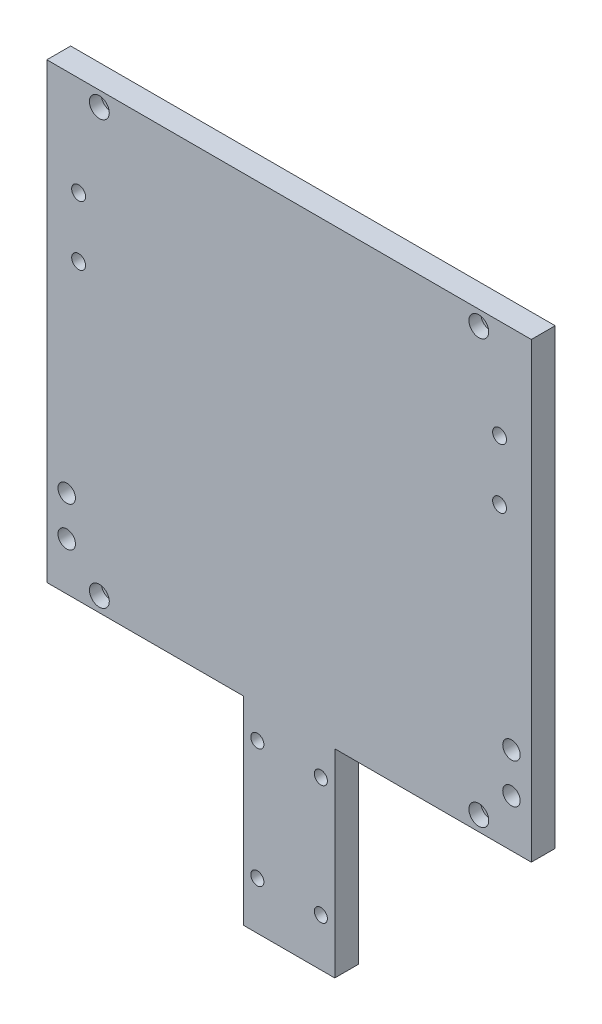
ISO-10303-21;
HEADER;
FILE_DESCRIPTION(('STEP AP214'),'2;1');
FILE_NAME('part.step','',(''),(''),'','','');
FILE_SCHEMA(('AUTOMOTIVE_DESIGN { 1 0 10303 214 1 1 1 1 }'));
ENDSEC;
DATA;
#1=APPLICATION_CONTEXT('core data for automotive mechanical design processes');
#2=APPLICATION_PROTOCOL_DEFINITION('international standard','automotive_design',2000,#1);
#3=PRODUCT_CONTEXT('',#1,'mechanical');
#4=PRODUCT('Part','Part','',(#3));
#5=PRODUCT_RELATED_PRODUCT_CATEGORY('part','',(#4));
#6=PRODUCT_DEFINITION_FORMATION('','',#4);
#7=PRODUCT_DEFINITION_CONTEXT('part definition',#1,'design');
#8=PRODUCT_DEFINITION('design','',#6,#7);
#9=PRODUCT_DEFINITION_SHAPE('','',#8);
#10=(LENGTH_UNIT() NAMED_UNIT(*) SI_UNIT(.MILLI.,.METRE.));
#11=(NAMED_UNIT(*) PLANE_ANGLE_UNIT() SI_UNIT($,.RADIAN.));
#12=(NAMED_UNIT(*) SI_UNIT($,.STERADIAN.) SOLID_ANGLE_UNIT());
#13=UNCERTAINTY_MEASURE_WITH_UNIT(LENGTH_MEASURE(1.E-05),#10,'distance_accuracy_value','');
#14=(GEOMETRIC_REPRESENTATION_CONTEXT(3) GLOBAL_UNCERTAINTY_ASSIGNED_CONTEXT((#13)) GLOBAL_UNIT_ASSIGNED_CONTEXT((#10,
#11,#12)) REPRESENTATION_CONTEXT('',''));
#15=CARTESIAN_POINT('',(0.,0.,0.));
#16=DIRECTION('',(0.,0.,1.));
#17=DIRECTION('',(1.,0.,0.));
#18=AXIS2_PLACEMENT_3D('',#15,#16,#17);
#19=CARTESIAN_POINT('',(-61.,-57.,6.));
#20=DIRECTION('',(0.,1.,0.));
#21=DIRECTION('',(0.,0.,1.));
#22=AXIS2_PLACEMENT_3D('',#19,#20,#21);
#23=PLANE('',#22);
#24=DIRECTION('',(0.,0.,1.));
#25=VECTOR('',#24,1.);
#26=CARTESIAN_POINT('',(11.5,-57.,0.));
#27=LINE('',#26,#25);
#28=CARTESIAN_POINT('',(11.5,-57.,0.));
#29=VERTEX_POINT('',#28);
#30=CARTESIAN_POINT('',(11.5,-57.,6.));
#31=VERTEX_POINT('',#30);
#32=EDGE_CURVE('E166',#29,#31,#27,.T.);
#33=ORIENTED_EDGE('',*,*,#32,.F.);
#34=DIRECTION('',(1.,0.,0.));
#35=VECTOR('',#34,1.);
#36=CARTESIAN_POINT('',(-61.,-57.,0.));
#37=LINE('',#36,#35);
#38=CARTESIAN_POINT('',(61.,-57.,0.));
#39=VERTEX_POINT('',#38);
#40=EDGE_CURVE('E92',#29,#39,#37,.T.);
#41=ORIENTED_EDGE('',*,*,#40,.T.);
#42=DIRECTION('',(0.,0.,-1.));
#43=VECTOR('',#42,1.);
#44=CARTESIAN_POINT('',(61.,-57.,6.));
#45=LINE('',#44,#43);
#46=CARTESIAN_POINT('',(61.,-57.,6.));
#47=VERTEX_POINT('',#46);
#48=EDGE_CURVE('E295',#47,#39,#45,.T.);
#49=ORIENTED_EDGE('',*,*,#48,.F.);
#50=DIRECTION('',(1.,0.,0.));
#51=VECTOR('',#50,1.);
#52=CARTESIAN_POINT('',(-61.,-57.,6.));
#53=LINE('',#52,#51);
#54=EDGE_CURVE('E70',#31,#47,#53,.T.);
#55=ORIENTED_EDGE('',*,*,#54,.F.);
#56=EDGE_LOOP('',(#33,#41,#49,#55));
#57=FACE_BOUND('',#56,.T.);
#58=ADVANCED_FACE('F43',(#57),#23,.F.);
#59=CARTESIAN_POINT('',(-47.78,53.28,0.));
#60=DIRECTION('',(0.,0.,1.));
#61=DIRECTION('',(1.,0.,0.));
#62=AXIS2_PLACEMENT_3D('',#59,#60,#61);
#63=CYLINDRICAL_SURFACE('',#62,1.65);
#64=CARTESIAN_POINT('',(-47.78,53.28,0.));
#65=DIRECTION('',(0.,0.,1.));
#66=DIRECTION('',(1.,0.,0.));
#67=AXIS2_PLACEMENT_3D('',#64,#65,#66);
#68=CIRCLE('',#67,1.65);
#69=CARTESIAN_POINT('',(-46.13,53.28,0.));
#70=VERTEX_POINT('',#69);
#71=EDGE_CURVE('E269',#70,#70,#68,.T.);
#72=ORIENTED_EDGE('',*,*,#71,.F.);
#73=EDGE_LOOP('',(#72));
#74=FACE_BOUND('',#73,.T.);
#75=CARTESIAN_POINT('',(-47.78,53.28,3.));
#76=DIRECTION('',(0.,0.,1.));
#77=DIRECTION('',(1.,0.,0.));
#78=AXIS2_PLACEMENT_3D('',#75,#76,#77);
#79=CIRCLE('',#78,1.65);
#80=CARTESIAN_POINT('',(-46.13,53.28,3.));
#81=VERTEX_POINT('',#80);
#82=EDGE_CURVE('E47',#81,#81,#79,.F.);
#83=ORIENTED_EDGE('',*,*,#82,.F.);
#84=EDGE_LOOP('',(#83));
#85=FACE_BOUND('',#84,.T.);
#86=ADVANCED_FACE('F335',(#74,#85),#63,.F.);
#87=CARTESIAN_POINT('',(47.78,-53.28,0.));
#88=DIRECTION('',(0.,0.,1.));
#89=DIRECTION('',(1.,0.,0.));
#90=AXIS2_PLACEMENT_3D('',#87,#88,#89);
#91=CYLINDRICAL_SURFACE('',#90,1.65);
#92=CARTESIAN_POINT('',(47.78,-53.28,0.));
#93=DIRECTION('',(0.,0.,1.));
#94=DIRECTION('',(1.,0.,0.));
#95=AXIS2_PLACEMENT_3D('',#92,#93,#94);
#96=CIRCLE('',#95,1.65);
#97=CARTESIAN_POINT('',(49.43,-53.28,0.));
#98=VERTEX_POINT('',#97);
#99=EDGE_CURVE('E270',#98,#98,#96,.T.);
#100=ORIENTED_EDGE('',*,*,#99,.F.);
#101=EDGE_LOOP('',(#100));
#102=FACE_BOUND('',#101,.T.);
#103=CARTESIAN_POINT('',(47.78,-53.28,3.));
#104=DIRECTION('',(0.,0.,1.));
#105=DIRECTION('',(1.,0.,0.));
#106=AXIS2_PLACEMENT_3D('',#103,#104,#105);
#107=CIRCLE('',#106,1.65);
#108=CARTESIAN_POINT('',(49.43,-53.28,3.));
#109=VERTEX_POINT('',#108);
#110=EDGE_CURVE('E319',#109,#109,#107,.F.);
#111=ORIENTED_EDGE('',*,*,#110,.F.);
#112=EDGE_LOOP('',(#111));
#113=FACE_BOUND('',#112,.T.);
#114=ADVANCED_FACE('F337',(#102,#113),#91,.F.);
#115=CARTESIAN_POINT('',(61.,57.,6.));
#116=DIRECTION('',(-1.,0.,0.));
#117=DIRECTION('',(0.,-1.,0.));
#118=AXIS2_PLACEMENT_3D('',#115,#116,#117);
#119=PLANE('',#118);
#120=DIRECTION('',(0.,1.,0.));
#121=VECTOR('',#120,1.);
#122=CARTESIAN_POINT('',(61.,57.,0.));
#123=LINE('',#122,#121);
#124=CARTESIAN_POINT('',(61.,57.,0.));
#125=VERTEX_POINT('',#124);
#126=EDGE_CURVE('E281',#39,#125,#123,.T.);
#127=ORIENTED_EDGE('',*,*,#126,.T.);
#128=DIRECTION('',(0.,0.,-1.));
#129=VECTOR('',#128,1.);
#130=CARTESIAN_POINT('',(61.,57.,6.));
#131=LINE('',#130,#129);
#132=CARTESIAN_POINT('',(61.,57.,6.));
#133=VERTEX_POINT('',#132);
#134=EDGE_CURVE('E11',#133,#125,#131,.T.);
#135=ORIENTED_EDGE('',*,*,#134,.F.);
#136=DIRECTION('',(0.,1.,0.));
#137=VECTOR('',#136,1.);
#138=CARTESIAN_POINT('',(61.,57.,6.));
#139=LINE('',#138,#137);
#140=EDGE_CURVE('E282',#47,#133,#139,.T.);
#141=ORIENTED_EDGE('',*,*,#140,.F.);
#142=ORIENTED_EDGE('',*,*,#48,.T.);
#143=EDGE_LOOP('',(#127,#135,#141,#142));
#144=FACE_BOUND('',#143,.T.);
#145=ADVANCED_FACE('F45',(#144),#119,.F.);
#146=CARTESIAN_POINT('',(-61.,57.,6.));
#147=DIRECTION('',(0.,-1.,0.));
#148=DIRECTION('',(0.,0.,-1.));
#149=AXIS2_PLACEMENT_3D('',#146,#147,#148);
#150=PLANE('',#149);
#151=DIRECTION('',(-1.,0.,0.));
#152=VECTOR('',#151,1.);
#153=CARTESIAN_POINT('',(-61.,57.,0.));
#154=LINE('',#153,#152);
#155=CARTESIAN_POINT('',(-61.,57.,0.));
#156=VERTEX_POINT('',#155);
#157=EDGE_CURVE('E299',#125,#156,#154,.T.);
#158=ORIENTED_EDGE('',*,*,#157,.T.);
#159=DIRECTION('',(0.,0.,-1.));
#160=VECTOR('',#159,1.);
#161=CARTESIAN_POINT('',(-61.,57.,6.));
#162=LINE('',#161,#160);
#163=CARTESIAN_POINT('',(-61.,57.,6.));
#164=VERTEX_POINT('',#163);
#165=EDGE_CURVE('E53',#164,#156,#162,.T.);
#166=ORIENTED_EDGE('',*,*,#165,.F.);
#167=DIRECTION('',(-1.,0.,0.));
#168=VECTOR('',#167,1.);
#169=CARTESIAN_POINT('',(-61.,57.,6.));
#170=LINE('',#169,#168);
#171=EDGE_CURVE('E99',#133,#164,#170,.T.);
#172=ORIENTED_EDGE('',*,*,#171,.F.);
#173=ORIENTED_EDGE('',*,*,#134,.T.);
#174=EDGE_LOOP('',(#158,#166,#172,#173));
#175=FACE_BOUND('',#174,.T.);
#176=ADVANCED_FACE('F364',(#175),#150,.F.);
#177=CARTESIAN_POINT('',(-61.,57.,6.));
#178=DIRECTION('',(1.,0.,0.));
#179=DIRECTION('',(0.,0.,-1.));
#180=AXIS2_PLACEMENT_3D('',#177,#178,#179);
#181=PLANE('',#180);
#182=DIRECTION('',(0.,-1.,0.));
#183=VECTOR('',#182,1.);
#184=CARTESIAN_POINT('',(-61.,57.,0.));
#185=LINE('',#184,#183);
#186=CARTESIAN_POINT('',(-61.,-57.,0.));
#187=VERTEX_POINT('',#186);
#188=EDGE_CURVE('E302',#156,#187,#185,.T.);
#189=ORIENTED_EDGE('',*,*,#188,.T.);
#190=DIRECTION('',(0.,0.,-1.));
#191=VECTOR('',#190,1.);
#192=CARTESIAN_POINT('',(-61.,-57.,6.));
#193=LINE('',#192,#191);
#194=CARTESIAN_POINT('',(-61.,-57.,6.));
#195=VERTEX_POINT('',#194);
#196=EDGE_CURVE('E309',#195,#187,#193,.T.);
#197=ORIENTED_EDGE('',*,*,#196,.F.);
#198=DIRECTION('',(0.,-1.,0.));
#199=VECTOR('',#198,1.);
#200=CARTESIAN_POINT('',(-61.,57.,6.));
#201=LINE('',#200,#199);
#202=EDGE_CURVE('E288',#164,#195,#201,.T.);
#203=ORIENTED_EDGE('',*,*,#202,.F.);
#204=ORIENTED_EDGE('',*,*,#165,.T.);
#205=EDGE_LOOP('',(#189,#197,#203,#204));
#206=FACE_BOUND('',#205,.T.);
#207=ADVANCED_FACE('F361',(#206),#181,.F.);
#208=CARTESIAN_POINT('',(-11.5,-57.,0.));
#209=VERTEX_POINT('',#208);
#210=EDGE_CURVE('E285',#187,#209,#37,.T.);
#211=ORIENTED_EDGE('',*,*,#210,.T.);
#212=DIRECTION('',(0.,0.,1.));
#213=VECTOR('',#212,1.);
#214=CARTESIAN_POINT('',(-11.5,-57.,0.));
#215=LINE('',#214,#213);
#216=CARTESIAN_POINT('',(-11.5,-57.,6.));
#217=VERTEX_POINT('',#216);
#218=EDGE_CURVE('E143',#209,#217,#215,.T.);
#219=ORIENTED_EDGE('',*,*,#218,.T.);
#220=EDGE_CURVE('E291',#195,#217,#53,.T.);
#221=ORIENTED_EDGE('',*,*,#220,.F.);
#222=ORIENTED_EDGE('',*,*,#196,.T.);
#223=EDGE_LOOP('',(#211,#219,#221,#222));
#224=FACE_BOUND('',#223,.T.);
#225=ADVANCED_FACE('F347',(#224),#23,.F.);
#226=CARTESIAN_POINT('',(0.,0.,6.));
#227=DIRECTION('',(0.,0.,1.));
#228=DIRECTION('',(1.,0.,0.));
#229=AXIS2_PLACEMENT_3D('',#226,#227,#228);
#230=PLANE('',#229);
#231=CARTESIAN_POINT('',(8.,-65.,6.));
#232=DIRECTION('',(0.,0.,1.));
#233=DIRECTION('',(-1.,0.,0.));
#234=AXIS2_PLACEMENT_3D('',#231,#232,#233);
#235=CIRCLE('',#234,1.65);
#236=CARTESIAN_POINT('',(6.35,-65.,6.));
#237=VERTEX_POINT('',#236);
#238=EDGE_CURVE('E387',#237,#237,#235,.T.);
#239=ORIENTED_EDGE('',*,*,#238,.F.);
#240=EDGE_LOOP('',(#239));
#241=FACE_BOUND('',#240,.T.);
#242=CARTESIAN_POINT('',(8.,-95.,6.));
#243=DIRECTION('',(0.,0.,1.));
#244=DIRECTION('',(-1.,0.,0.));
#245=AXIS2_PLACEMENT_3D('',#242,#243,#244);
#246=CIRCLE('',#245,1.65);
#247=CARTESIAN_POINT('',(6.35,-95.,6.));
#248=VERTEX_POINT('',#247);
#249=EDGE_CURVE('E386',#248,#248,#246,.T.);
#250=ORIENTED_EDGE('',*,*,#249,.F.);
#251=EDGE_LOOP('',(#250));
#252=FACE_BOUND('',#251,.T.);
#253=CARTESIAN_POINT('',(-8.,-95.,6.));
#254=DIRECTION('',(0.,0.,1.));
#255=DIRECTION('',(1.,0.,0.));
#256=AXIS2_PLACEMENT_3D('',#253,#254,#255);
#257=CIRCLE('',#256,1.65);
#258=CARTESIAN_POINT('',(-6.35,-95.,6.));
#259=VERTEX_POINT('',#258);
#260=EDGE_CURVE('E462',#259,#259,#257,.T.);
#261=ORIENTED_EDGE('',*,*,#260,.F.);
#262=EDGE_LOOP('',(#261));
#263=FACE_BOUND('',#262,.T.);
#264=CARTESIAN_POINT('',(-8.,-65.,6.));
#265=DIRECTION('',(0.,0.,1.));
#266=DIRECTION('',(1.,0.,0.));
#267=AXIS2_PLACEMENT_3D('',#264,#265,#266);
#268=CIRCLE('',#267,1.65);
#269=CARTESIAN_POINT('',(-6.35,-65.,6.));
#270=VERTEX_POINT('',#269);
#271=EDGE_CURVE('E153',#270,#270,#268,.T.);
#272=ORIENTED_EDGE('',*,*,#271,.F.);
#273=EDGE_LOOP('',(#272));
#274=FACE_BOUND('',#273,.T.);
#275=CARTESIAN_POINT('',(53.,32.,6.));
#276=DIRECTION('',(0.,0.,-1.));
#277=DIRECTION('',(-1.,0.,0.));
#278=AXIS2_PLACEMENT_3D('',#275,#276,#277);
#279=CIRCLE('',#278,1.75);
#280=CARTESIAN_POINT('',(51.25,32.,6.));
#281=VERTEX_POINT('',#280);
#282=EDGE_CURVE('E176',#281,#281,#279,.T.);
#283=ORIENTED_EDGE('',*,*,#282,.T.);
#284=EDGE_LOOP('',(#283));
#285=FACE_BOUND('',#284,.T.);
#286=CARTESIAN_POINT('',(53.,17.,6.));
#287=DIRECTION('',(0.,0.,-1.));
#288=DIRECTION('',(-1.,0.,0.));
#289=AXIS2_PLACEMENT_3D('',#286,#287,#288);
#290=CIRCLE('',#289,1.75);
#291=CARTESIAN_POINT('',(51.25,17.,6.));
#292=VERTEX_POINT('',#291);
#293=EDGE_CURVE('E184',#292,#292,#290,.T.);
#294=ORIENTED_EDGE('',*,*,#293,.T.);
#295=EDGE_LOOP('',(#294));
#296=FACE_BOUND('',#295,.T.);
#297=CARTESIAN_POINT('',(56.,-35.,6.));
#298=DIRECTION('',(0.,0.,-1.));
#299=DIRECTION('',(-1.,0.,0.));
#300=AXIS2_PLACEMENT_3D('',#297,#298,#299);
#301=CIRCLE('',#300,2.2);
#302=CARTESIAN_POINT('',(53.8,-35.,6.));
#303=VERTEX_POINT('',#302);
#304=EDGE_CURVE('E192',#303,#303,#301,.T.);
#305=ORIENTED_EDGE('',*,*,#304,.T.);
#306=EDGE_LOOP('',(#305));
#307=FACE_BOUND('',#306,.T.);
#308=CARTESIAN_POINT('',(56.,-45.,6.));
#309=DIRECTION('',(0.,0.,-1.));
#310=DIRECTION('',(-1.,0.,0.));
#311=AXIS2_PLACEMENT_3D('',#308,#309,#310);
#312=CIRCLE('',#311,2.2);
#313=CARTESIAN_POINT('',(53.8,-45.,6.));
#314=VERTEX_POINT('',#313);
#315=EDGE_CURVE('E165',#314,#314,#312,.T.);
#316=ORIENTED_EDGE('',*,*,#315,.T.);
#317=EDGE_LOOP('',(#316));
#318=FACE_BOUND('',#317,.T.);
#319=CARTESIAN_POINT('',(-53.,32.,6.));
#320=DIRECTION('',(0.,0.,1.));
#321=DIRECTION('',(1.,0.,0.));
#322=AXIS2_PLACEMENT_3D('',#319,#320,#321);
#323=CIRCLE('',#322,1.75);
#324=CARTESIAN_POINT('',(-51.25,32.,6.));
#325=VERTEX_POINT('',#324);
#326=EDGE_CURVE('E207',#325,#325,#323,.T.);
#327=ORIENTED_EDGE('',*,*,#326,.F.);
#328=EDGE_LOOP('',(#327));
#329=FACE_BOUND('',#328,.T.);
#330=CARTESIAN_POINT('',(-53.,17.,6.));
#331=DIRECTION('',(0.,0.,1.));
#332=DIRECTION('',(1.,0.,0.));
#333=AXIS2_PLACEMENT_3D('',#330,#331,#332);
#334=CIRCLE('',#333,1.75);
#335=CARTESIAN_POINT('',(-51.25,17.,6.));
#336=VERTEX_POINT('',#335);
#337=EDGE_CURVE('E215',#336,#336,#334,.T.);
#338=ORIENTED_EDGE('',*,*,#337,.F.);
#339=EDGE_LOOP('',(#338));
#340=FACE_BOUND('',#339,.T.);
#341=CARTESIAN_POINT('',(-56.,-35.,6.));
#342=DIRECTION('',(0.,0.,1.));
#343=DIRECTION('',(1.,0.,0.));
#344=AXIS2_PLACEMENT_3D('',#341,#342,#343);
#345=CIRCLE('',#344,2.2);
#346=CARTESIAN_POINT('',(-53.8,-35.,6.));
#347=VERTEX_POINT('',#346);
#348=EDGE_CURVE('E223',#347,#347,#345,.T.);
#349=ORIENTED_EDGE('',*,*,#348,.F.);
#350=EDGE_LOOP('',(#349));
#351=FACE_BOUND('',#350,.T.);
#352=CARTESIAN_POINT('',(-56.,-45.,6.));
#353=DIRECTION('',(0.,0.,1.));
#354=DIRECTION('',(1.,0.,0.));
#355=AXIS2_PLACEMENT_3D('',#352,#353,#354);
#356=CIRCLE('',#355,2.2);
#357=CARTESIAN_POINT('',(-53.8,-45.,6.));
#358=VERTEX_POINT('',#357);
#359=EDGE_CURVE('E175',#358,#358,#356,.T.);
#360=ORIENTED_EDGE('',*,*,#359,.F.);
#361=EDGE_LOOP('',(#360));
#362=FACE_BOUND('',#361,.T.);
#363=CARTESIAN_POINT('',(-47.78,-53.28,6.));
#364=DIRECTION('',(0.,0.,1.));
#365=DIRECTION('',(-1.,0.,0.));
#366=AXIS2_PLACEMENT_3D('',#363,#364,#365);
#367=CIRCLE('',#366,2.5);
#368=CARTESIAN_POINT('',(-50.28,-53.28,6.));
#369=VERTEX_POINT('',#368);
#370=EDGE_CURVE('E206',#369,#369,#367,.T.);
#371=ORIENTED_EDGE('',*,*,#370,.F.);
#372=EDGE_LOOP('',(#371));
#373=FACE_BOUND('',#372,.T.);
#374=CARTESIAN_POINT('',(47.78,-53.28,6.));
#375=DIRECTION('',(0.,0.,1.));
#376=DIRECTION('',(1.,0.,0.));
#377=AXIS2_PLACEMENT_3D('',#374,#375,#376);
#378=CIRCLE('',#377,2.5);
#379=CARTESIAN_POINT('',(50.28,-53.28,6.));
#380=VERTEX_POINT('',#379);
#381=EDGE_CURVE('E247',#380,#380,#378,.T.);
#382=ORIENTED_EDGE('',*,*,#381,.F.);
#383=EDGE_LOOP('',(#382));
#384=FACE_BOUND('',#383,.T.);
#385=CARTESIAN_POINT('',(47.78,53.28,6.));
#386=DIRECTION('',(0.,0.,1.));
#387=DIRECTION('',(-1.,0.,0.));
#388=AXIS2_PLACEMENT_3D('',#385,#386,#387);
#389=CIRCLE('',#388,2.5);
#390=CARTESIAN_POINT('',(45.28,53.28,6.));
#391=VERTEX_POINT('',#390);
#392=EDGE_CURVE('E239',#391,#391,#389,.T.);
#393=ORIENTED_EDGE('',*,*,#392,.F.);
#394=EDGE_LOOP('',(#393));
#395=FACE_BOUND('',#394,.T.);
#396=CARTESIAN_POINT('',(-47.78,53.28,6.));
#397=DIRECTION('',(0.,0.,1.));
#398=DIRECTION('',(1.,0.,0.));
#399=AXIS2_PLACEMENT_3D('',#396,#397,#398);
#400=CIRCLE('',#399,2.5);
#401=CARTESIAN_POINT('',(-45.28,53.28,6.));
#402=VERTEX_POINT('',#401);
#403=EDGE_CURVE('E238',#402,#402,#400,.T.);
#404=ORIENTED_EDGE('',*,*,#403,.F.);
#405=EDGE_LOOP('',(#404));
#406=FACE_BOUND('',#405,.T.);
#407=ORIENTED_EDGE('',*,*,#140,.T.);
#408=ORIENTED_EDGE('',*,*,#171,.T.);
#409=ORIENTED_EDGE('',*,*,#202,.T.);
#410=ORIENTED_EDGE('',*,*,#220,.T.);
#411=DIRECTION('',(0.,-1.,0.));
#412=VECTOR('',#411,1.);
#413=CARTESIAN_POINT('',(-11.5,-57.,6.));
#414=LINE('',#413,#412);
#415=CARTESIAN_POINT('',(-11.5,-107.,6.));
#416=VERTEX_POINT('',#415);
#417=EDGE_CURVE('E61',#217,#416,#414,.T.);
#418=ORIENTED_EDGE('',*,*,#417,.T.);
#419=DIRECTION('',(1.,0.,0.));
#420=VECTOR('',#419,1.);
#421=CARTESIAN_POINT('',(-11.5,-107.,6.));
#422=LINE('',#421,#420);
#423=CARTESIAN_POINT('',(11.5,-107.,6.));
#424=VERTEX_POINT('',#423);
#425=EDGE_CURVE('E126',#416,#424,#422,.T.);
#426=ORIENTED_EDGE('',*,*,#425,.T.);
#427=DIRECTION('',(0.,1.,0.));
#428=VECTOR('',#427,1.);
#429=CARTESIAN_POINT('',(11.5,-57.,6.));
#430=LINE('',#429,#428);
#431=EDGE_CURVE('E145',#424,#31,#430,.T.);
#432=ORIENTED_EDGE('',*,*,#431,.T.);
#433=ORIENTED_EDGE('',*,*,#54,.T.);
#434=EDGE_LOOP('',(#407,#408,#409,#410,#418,#426,#432,#433));
#435=FACE_BOUND('',#434,.T.);
#436=ADVANCED_FACE('F352',(#241,#252,#263,#274,#285,#296,#307,#318,#329,#340,#351,#362,#373,
#384,#395,#406,#435),#230,.T.);
#437=CARTESIAN_POINT('',(0.,0.,0.));
#438=DIRECTION('',(0.,0.,1.));
#439=DIRECTION('',(1.,0.,0.));
#440=AXIS2_PLACEMENT_3D('',#437,#438,#439);
#441=PLANE('',#440);
#442=CARTESIAN_POINT('',(8.,-65.,0.));
#443=DIRECTION('',(0.,0.,1.));
#444=DIRECTION('',(-1.,0.,0.));
#445=AXIS2_PLACEMENT_3D('',#442,#443,#444);
#446=CIRCLE('',#445,1.65);
#447=CARTESIAN_POINT('',(6.35,-65.,0.));
#448=VERTEX_POINT('',#447);
#449=EDGE_CURVE('E383',#448,#448,#446,.T.);
#450=ORIENTED_EDGE('',*,*,#449,.T.);
#451=EDGE_LOOP('',(#450));
#452=FACE_BOUND('',#451,.T.);
#453=CARTESIAN_POINT('',(8.,-95.,0.));
#454=DIRECTION('',(0.,0.,1.));
#455=DIRECTION('',(-1.,0.,0.));
#456=AXIS2_PLACEMENT_3D('',#453,#454,#455);
#457=CIRCLE('',#456,1.65);
#458=CARTESIAN_POINT('',(6.35,-95.,0.));
#459=VERTEX_POINT('',#458);
#460=EDGE_CURVE('E459',#459,#459,#457,.T.);
#461=ORIENTED_EDGE('',*,*,#460,.T.);
#462=EDGE_LOOP('',(#461));
#463=FACE_BOUND('',#462,.T.);
#464=CARTESIAN_POINT('',(-8.,-95.,0.));
#465=DIRECTION('',(0.,0.,1.));
#466=DIRECTION('',(1.,0.,0.));
#467=AXIS2_PLACEMENT_3D('',#464,#465,#466);
#468=CIRCLE('',#467,1.65);
#469=CARTESIAN_POINT('',(-6.35,-95.,0.));
#470=VERTEX_POINT('',#469);
#471=EDGE_CURVE('E397',#470,#470,#468,.T.);
#472=ORIENTED_EDGE('',*,*,#471,.T.);
#473=EDGE_LOOP('',(#472));
#474=FACE_BOUND('',#473,.T.);
#475=CARTESIAN_POINT('',(-8.,-65.,0.));
#476=DIRECTION('',(0.,0.,1.));
#477=DIRECTION('',(1.,0.,0.));
#478=AXIS2_PLACEMENT_3D('',#475,#476,#477);
#479=CIRCLE('',#478,1.65);
#480=CARTESIAN_POINT('',(-6.35,-65.,0.));
#481=VERTEX_POINT('',#480);
#482=EDGE_CURVE('E160',#481,#481,#479,.T.);
#483=ORIENTED_EDGE('',*,*,#482,.T.);
#484=EDGE_LOOP('',(#483));
#485=FACE_BOUND('',#484,.T.);
#486=CARTESIAN_POINT('',(53.,32.,0.));
#487=DIRECTION('',(0.,0.,-1.));
#488=DIRECTION('',(-1.,0.,0.));
#489=AXIS2_PLACEMENT_3D('',#486,#487,#488);
#490=CIRCLE('',#489,1.75);
#491=CARTESIAN_POINT('',(51.25,32.,0.));
#492=VERTEX_POINT('',#491);
#493=EDGE_CURVE('E171',#492,#492,#490,.T.);
#494=ORIENTED_EDGE('',*,*,#493,.F.);
#495=EDGE_LOOP('',(#494));
#496=FACE_BOUND('',#495,.T.);
#497=CARTESIAN_POINT('',(53.,17.,0.));
#498=DIRECTION('',(0.,0.,-1.));
#499=DIRECTION('',(-1.,0.,0.));
#500=AXIS2_PLACEMENT_3D('',#497,#498,#499);
#501=CIRCLE('',#500,1.75);
#502=CARTESIAN_POINT('',(51.25,17.,0.));
#503=VERTEX_POINT('',#502);
#504=EDGE_CURVE('E180',#503,#503,#501,.T.);
#505=ORIENTED_EDGE('',*,*,#504,.F.);
#506=EDGE_LOOP('',(#505));
#507=FACE_BOUND('',#506,.T.);
#508=CARTESIAN_POINT('',(56.,-35.,0.));
#509=DIRECTION('',(0.,0.,-1.));
#510=DIRECTION('',(-1.,0.,0.));
#511=AXIS2_PLACEMENT_3D('',#508,#509,#510);
#512=CIRCLE('',#511,2.2);
#513=CARTESIAN_POINT('',(53.8,-35.,0.));
#514=VERTEX_POINT('',#513);
#515=EDGE_CURVE('E188',#514,#514,#512,.T.);
#516=ORIENTED_EDGE('',*,*,#515,.F.);
#517=EDGE_LOOP('',(#516));
#518=FACE_BOUND('',#517,.T.);
#519=CARTESIAN_POINT('',(56.,-45.,0.));
#520=DIRECTION('',(0.,0.,-1.));
#521=DIRECTION('',(-1.,0.,0.));
#522=AXIS2_PLACEMENT_3D('',#519,#520,#521);
#523=CIRCLE('',#522,2.2);
#524=CARTESIAN_POINT('',(53.8,-45.,0.));
#525=VERTEX_POINT('',#524);
#526=EDGE_CURVE('E196',#525,#525,#523,.T.);
#527=ORIENTED_EDGE('',*,*,#526,.F.);
#528=EDGE_LOOP('',(#527));
#529=FACE_BOUND('',#528,.T.);
#530=CARTESIAN_POINT('',(-53.,32.,0.));
#531=DIRECTION('',(0.,0.,1.));
#532=DIRECTION('',(1.,0.,0.));
#533=AXIS2_PLACEMENT_3D('',#530,#531,#532);
#534=CIRCLE('',#533,1.75);
#535=CARTESIAN_POINT('',(-51.25,32.,0.));
#536=VERTEX_POINT('',#535);
#537=EDGE_CURVE('E203',#536,#536,#534,.T.);
#538=ORIENTED_EDGE('',*,*,#537,.T.);
#539=EDGE_LOOP('',(#538));
#540=FACE_BOUND('',#539,.T.);
#541=CARTESIAN_POINT('',(-53.,17.,0.));
#542=DIRECTION('',(0.,0.,1.));
#543=DIRECTION('',(1.,0.,0.));
#544=AXIS2_PLACEMENT_3D('',#541,#542,#543);
#545=CIRCLE('',#544,1.75);
#546=CARTESIAN_POINT('',(-51.25,17.,0.));
#547=VERTEX_POINT('',#546);
#548=EDGE_CURVE('E211',#547,#547,#545,.T.);
#549=ORIENTED_EDGE('',*,*,#548,.T.);
#550=EDGE_LOOP('',(#549));
#551=FACE_BOUND('',#550,.T.);
#552=CARTESIAN_POINT('',(-56.,-35.,0.));
#553=DIRECTION('',(0.,0.,1.));
#554=DIRECTION('',(1.,0.,0.));
#555=AXIS2_PLACEMENT_3D('',#552,#553,#554);
#556=CIRCLE('',#555,2.2);
#557=CARTESIAN_POINT('',(-53.8,-35.,0.));
#558=VERTEX_POINT('',#557);
#559=EDGE_CURVE('E219',#558,#558,#556,.T.);
#560=ORIENTED_EDGE('',*,*,#559,.T.);
#561=EDGE_LOOP('',(#560));
#562=FACE_BOUND('',#561,.T.);
#563=CARTESIAN_POINT('',(-56.,-45.,0.));
#564=DIRECTION('',(0.,0.,1.));
#565=DIRECTION('',(1.,0.,0.));
#566=AXIS2_PLACEMENT_3D('',#563,#564,#565);
#567=CIRCLE('',#566,2.2);
#568=CARTESIAN_POINT('',(-53.8,-45.,0.));
#569=VERTEX_POINT('',#568);
#570=EDGE_CURVE('E227',#569,#569,#567,.T.);
#571=ORIENTED_EDGE('',*,*,#570,.T.);
#572=EDGE_LOOP('',(#571));
#573=FACE_BOUND('',#572,.T.);
#574=CARTESIAN_POINT('',(-47.78,-53.28,0.));
#575=DIRECTION('',(0.,0.,1.));
#576=DIRECTION('',(-1.,0.,0.));
#577=AXIS2_PLACEMENT_3D('',#574,#575,#576);
#578=CIRCLE('',#577,1.65);
#579=CARTESIAN_POINT('',(-49.43,-53.28,0.));
#580=VERTEX_POINT('',#579);
#581=EDGE_CURVE('E274',#580,#580,#578,.T.);
#582=ORIENTED_EDGE('',*,*,#581,.T.);
#583=EDGE_LOOP('',(#582));
#584=FACE_BOUND('',#583,.T.);
#585=ORIENTED_EDGE('',*,*,#99,.T.);
#586=EDGE_LOOP('',(#585));
#587=FACE_BOUND('',#586,.T.);
#588=CARTESIAN_POINT('',(47.78,53.28,0.));
#589=DIRECTION('',(0.,0.,1.));
#590=DIRECTION('',(-1.,0.,0.));
#591=AXIS2_PLACEMENT_3D('',#588,#589,#590);
#592=CIRCLE('',#591,1.65);
#593=CARTESIAN_POINT('',(46.13,53.28,0.));
#594=VERTEX_POINT('',#593);
#595=EDGE_CURVE('E265',#594,#594,#592,.T.);
#596=ORIENTED_EDGE('',*,*,#595,.T.);
#597=EDGE_LOOP('',(#596));
#598=FACE_BOUND('',#597,.T.);
#599=ORIENTED_EDGE('',*,*,#71,.T.);
#600=EDGE_LOOP('',(#599));
#601=FACE_BOUND('',#600,.T.);
#602=ORIENTED_EDGE('',*,*,#126,.F.);
#603=ORIENTED_EDGE('',*,*,#40,.F.);
#604=DIRECTION('',(0.,1.,0.));
#605=VECTOR('',#604,1.);
#606=CARTESIAN_POINT('',(11.5,-57.,0.));
#607=LINE('',#606,#605);
#608=CARTESIAN_POINT('',(11.5,-107.,0.));
#609=VERTEX_POINT('',#608);
#610=EDGE_CURVE('E130',#609,#29,#607,.T.);
#611=ORIENTED_EDGE('',*,*,#610,.F.);
#612=DIRECTION('',(1.,0.,0.));
#613=VECTOR('',#612,1.);
#614=CARTESIAN_POINT('',(-11.5,-107.,0.));
#615=LINE('',#614,#613);
#616=CARTESIAN_POINT('',(-11.5,-107.,0.));
#617=VERTEX_POINT('',#616);
#618=EDGE_CURVE('E124',#617,#609,#615,.T.);
#619=ORIENTED_EDGE('',*,*,#618,.F.);
#620=DIRECTION('',(0.,-1.,0.));
#621=VECTOR('',#620,1.);
#622=CARTESIAN_POINT('',(-11.5,-57.,0.));
#623=LINE('',#622,#621);
#624=EDGE_CURVE('E138',#209,#617,#623,.T.);
#625=ORIENTED_EDGE('',*,*,#624,.F.);
#626=ORIENTED_EDGE('',*,*,#210,.F.);
#627=ORIENTED_EDGE('',*,*,#188,.F.);
#628=ORIENTED_EDGE('',*,*,#157,.F.);
#629=EDGE_LOOP('',(#602,#603,#611,#619,#625,#626,#627,#628));
#630=FACE_BOUND('',#629,.T.);
#631=ADVANCED_FACE('F136',(#452,#463,#474,#485,#496,#507,#518,#529,#540,#551,#562,#573,#584,
#587,#598,#601,#630),#441,.F.);
#632=CARTESIAN_POINT('',(47.78,53.28,0.));
#633=DIRECTION('',(0.,0.,1.));
#634=DIRECTION('',(1.,0.,0.));
#635=AXIS2_PLACEMENT_3D('',#632,#633,#634);
#636=CYLINDRICAL_SURFACE('',#635,1.65);
#637=CARTESIAN_POINT('',(47.78,53.28,3.));
#638=DIRECTION('',(0.,0.,-1.));
#639=DIRECTION('',(-1.,0.,0.));
#640=AXIS2_PLACEMENT_3D('',#637,#638,#639);
#641=CIRCLE('',#640,1.65);
#642=CARTESIAN_POINT('',(46.13,53.28,3.));
#643=VERTEX_POINT('',#642);
#644=EDGE_CURVE('E322',#643,#643,#641,.F.);
#645=ORIENTED_EDGE('',*,*,#644,.T.);
#646=EDGE_LOOP('',(#645));
#647=FACE_BOUND('',#646,.T.);
#648=ORIENTED_EDGE('',*,*,#595,.F.);
#649=EDGE_LOOP('',(#648));
#650=FACE_BOUND('',#649,.T.);
#651=ADVANCED_FACE('F357',(#647,#650),#636,.F.);
#652=CARTESIAN_POINT('',(-47.78,-53.28,0.));
#653=DIRECTION('',(0.,0.,1.));
#654=DIRECTION('',(1.,0.,0.));
#655=AXIS2_PLACEMENT_3D('',#652,#653,#654);
#656=CYLINDRICAL_SURFACE('',#655,1.65);
#657=CARTESIAN_POINT('',(-47.78,-53.28,3.));
#658=DIRECTION('',(0.,0.,-1.));
#659=DIRECTION('',(-1.,0.,0.));
#660=AXIS2_PLACEMENT_3D('',#657,#658,#659);
#661=CIRCLE('',#660,1.65);
#662=CARTESIAN_POINT('',(-49.43,-53.28,3.));
#663=VERTEX_POINT('',#662);
#664=EDGE_CURVE('E261',#663,#663,#661,.F.);
#665=ORIENTED_EDGE('',*,*,#664,.T.);
#666=EDGE_LOOP('',(#665));
#667=FACE_BOUND('',#666,.T.);
#668=ORIENTED_EDGE('',*,*,#581,.F.);
#669=EDGE_LOOP('',(#668));
#670=FACE_BOUND('',#669,.T.);
#671=ADVANCED_FACE('F351',(#667,#670),#656,.F.);
#672=CARTESIAN_POINT('',(-47.78,-53.28,3.));
#673=DIRECTION('',(0.,0.,-1.));
#674=DIRECTION('',(-1.,0.,0.));
#675=AXIS2_PLACEMENT_3D('',#672,#673,#674);
#676=PLANE('',#675);
#677=CARTESIAN_POINT('',(-47.78,-53.28,3.));
#678=DIRECTION('',(0.,0.,1.));
#679=DIRECTION('',(-1.,0.,0.));
#680=AXIS2_PLACEMENT_3D('',#677,#678,#679);
#681=CIRCLE('',#680,2.5);
#682=CARTESIAN_POINT('',(-50.28,-53.28,3.));
#683=VERTEX_POINT('',#682);
#684=EDGE_CURVE('E251',#683,#683,#681,.T.);
#685=ORIENTED_EDGE('',*,*,#684,.T.);
#686=EDGE_LOOP('',(#685));
#687=FACE_BOUND('',#686,.T.);
#688=ORIENTED_EDGE('',*,*,#664,.F.);
#689=EDGE_LOOP('',(#688));
#690=FACE_BOUND('',#689,.T.);
#691=ADVANCED_FACE('F527',(#687,#690),#676,.F.);
#692=CARTESIAN_POINT('',(-47.78,-53.28,3.));
#693=DIRECTION('',(0.,0.,1.));
#694=DIRECTION('',(1.,0.,0.));
#695=AXIS2_PLACEMENT_3D('',#692,#693,#694);
#696=CYLINDRICAL_SURFACE('',#695,2.5);
#697=ORIENTED_EDGE('',*,*,#684,.F.);
#698=EDGE_LOOP('',(#697));
#699=FACE_BOUND('',#698,.T.);
#700=ORIENTED_EDGE('',*,*,#370,.T.);
#701=EDGE_LOOP('',(#700));
#702=FACE_BOUND('',#701,.T.);
#703=ADVANCED_FACE('F536',(#699,#702),#696,.F.);
#704=CARTESIAN_POINT('',(47.78,-53.28,3.));
#705=DIRECTION('',(0.,0.,1.));
#706=DIRECTION('',(1.,0.,0.));
#707=AXIS2_PLACEMENT_3D('',#704,#705,#706);
#708=PLANE('',#707);
#709=CARTESIAN_POINT('',(47.78,-53.28,3.));
#710=DIRECTION('',(0.,0.,1.));
#711=DIRECTION('',(1.,0.,0.));
#712=AXIS2_PLACEMENT_3D('',#709,#710,#711);
#713=CIRCLE('',#712,2.5);
#714=CARTESIAN_POINT('',(50.28,-53.28,3.));
#715=VERTEX_POINT('',#714);
#716=EDGE_CURVE('E243',#715,#715,#713,.T.);
#717=ORIENTED_EDGE('',*,*,#716,.T.);
#718=EDGE_LOOP('',(#717));
#719=FACE_BOUND('',#718,.T.);
#720=ORIENTED_EDGE('',*,*,#110,.T.);
#721=EDGE_LOOP('',(#720));
#722=FACE_BOUND('',#721,.T.);
#723=ADVANCED_FACE('F548',(#719,#722),#708,.T.);
#724=CARTESIAN_POINT('',(47.78,-53.28,3.));
#725=DIRECTION('',(0.,0.,1.));
#726=DIRECTION('',(1.,0.,0.));
#727=AXIS2_PLACEMENT_3D('',#724,#725,#726);
#728=CYLINDRICAL_SURFACE('',#727,2.5);
#729=ORIENTED_EDGE('',*,*,#716,.F.);
#730=EDGE_LOOP('',(#729));
#731=FACE_BOUND('',#730,.T.);
#732=ORIENTED_EDGE('',*,*,#381,.T.);
#733=EDGE_LOOP('',(#732));
#734=FACE_BOUND('',#733,.T.);
#735=ADVANCED_FACE('F550',(#731,#734),#728,.F.);
#736=CARTESIAN_POINT('',(47.78,53.28,3.));
#737=DIRECTION('',(0.,0.,-1.));
#738=DIRECTION('',(-1.,0.,0.));
#739=AXIS2_PLACEMENT_3D('',#736,#737,#738);
#740=PLANE('',#739);
#741=CARTESIAN_POINT('',(47.78,53.28,3.));
#742=DIRECTION('',(0.,0.,1.));
#743=DIRECTION('',(-1.,0.,0.));
#744=AXIS2_PLACEMENT_3D('',#741,#742,#743);
#745=CIRCLE('',#744,2.5);
#746=CARTESIAN_POINT('',(45.28,53.28,3.));
#747=VERTEX_POINT('',#746);
#748=EDGE_CURVE('E234',#747,#747,#745,.T.);
#749=ORIENTED_EDGE('',*,*,#748,.T.);
#750=EDGE_LOOP('',(#749));
#751=FACE_BOUND('',#750,.T.);
#752=ORIENTED_EDGE('',*,*,#644,.F.);
#753=EDGE_LOOP('',(#752));
#754=FACE_BOUND('',#753,.T.);
#755=ADVANCED_FACE('F557',(#751,#754),#740,.F.);
#756=CARTESIAN_POINT('',(47.78,53.28,3.));
#757=DIRECTION('',(0.,0.,1.));
#758=DIRECTION('',(1.,0.,0.));
#759=AXIS2_PLACEMENT_3D('',#756,#757,#758);
#760=CYLINDRICAL_SURFACE('',#759,2.5);
#761=ORIENTED_EDGE('',*,*,#748,.F.);
#762=EDGE_LOOP('',(#761));
#763=FACE_BOUND('',#762,.T.);
#764=ORIENTED_EDGE('',*,*,#392,.T.);
#765=EDGE_LOOP('',(#764));
#766=FACE_BOUND('',#765,.T.);
#767=ADVANCED_FACE('F517',(#763,#766),#760,.F.);
#768=CARTESIAN_POINT('',(-47.78,53.28,3.));
#769=DIRECTION('',(0.,0.,1.));
#770=DIRECTION('',(1.,0.,0.));
#771=AXIS2_PLACEMENT_3D('',#768,#769,#770);
#772=PLANE('',#771);
#773=CARTESIAN_POINT('',(-47.78,53.28,3.));
#774=DIRECTION('',(0.,0.,1.));
#775=DIRECTION('',(1.,0.,0.));
#776=AXIS2_PLACEMENT_3D('',#773,#774,#775);
#777=CIRCLE('',#776,2.5);
#778=CARTESIAN_POINT('',(-45.28,53.28,3.));
#779=VERTEX_POINT('',#778);
#780=EDGE_CURVE('E257',#779,#779,#777,.T.);
#781=ORIENTED_EDGE('',*,*,#780,.T.);
#782=EDGE_LOOP('',(#781));
#783=FACE_BOUND('',#782,.T.);
#784=ORIENTED_EDGE('',*,*,#82,.T.);
#785=EDGE_LOOP('',(#784));
#786=FACE_BOUND('',#785,.T.);
#787=ADVANCED_FACE('F333',(#783,#786),#772,.T.);
#788=CARTESIAN_POINT('',(-47.78,53.28,3.));
#789=DIRECTION('',(0.,0.,1.));
#790=DIRECTION('',(1.,0.,0.));
#791=AXIS2_PLACEMENT_3D('',#788,#789,#790);
#792=CYLINDRICAL_SURFACE('',#791,2.5);
#793=ORIENTED_EDGE('',*,*,#780,.F.);
#794=EDGE_LOOP('',(#793));
#795=FACE_BOUND('',#794,.T.);
#796=ORIENTED_EDGE('',*,*,#403,.T.);
#797=EDGE_LOOP('',(#796));
#798=FACE_BOUND('',#797,.T.);
#799=ADVANCED_FACE('F505',(#795,#798),#792,.F.);
#800=CARTESIAN_POINT('',(-56.,-45.,0.));
#801=DIRECTION('',(0.,0.,1.));
#802=DIRECTION('',(1.,0.,0.));
#803=AXIS2_PLACEMENT_3D('',#800,#801,#802);
#804=CYLINDRICAL_SURFACE('',#803,2.2);
#805=ORIENTED_EDGE('',*,*,#570,.F.);
#806=EDGE_LOOP('',(#805));
#807=FACE_BOUND('',#806,.T.);
#808=ORIENTED_EDGE('',*,*,#359,.T.);
#809=EDGE_LOOP('',(#808));
#810=FACE_BOUND('',#809,.T.);
#811=ADVANCED_FACE('F507',(#807,#810),#804,.F.);
#812=CARTESIAN_POINT('',(-56.,-35.,0.));
#813=DIRECTION('',(0.,0.,1.));
#814=DIRECTION('',(1.,0.,0.));
#815=AXIS2_PLACEMENT_3D('',#812,#813,#814);
#816=CYLINDRICAL_SURFACE('',#815,2.2);
#817=ORIENTED_EDGE('',*,*,#559,.F.);
#818=EDGE_LOOP('',(#817));
#819=FACE_BOUND('',#818,.T.);
#820=ORIENTED_EDGE('',*,*,#348,.T.);
#821=EDGE_LOOP('',(#820));
#822=FACE_BOUND('',#821,.T.);
#823=ADVANCED_FACE('F514',(#819,#822),#816,.F.);
#824=CARTESIAN_POINT('',(-53.,17.,0.));
#825=DIRECTION('',(0.,0.,1.));
#826=DIRECTION('',(1.,0.,0.));
#827=AXIS2_PLACEMENT_3D('',#824,#825,#826);
#828=CYLINDRICAL_SURFACE('',#827,1.75);
#829=ORIENTED_EDGE('',*,*,#548,.F.);
#830=EDGE_LOOP('',(#829));
#831=FACE_BOUND('',#830,.T.);
#832=ORIENTED_EDGE('',*,*,#337,.T.);
#833=EDGE_LOOP('',(#832));
#834=FACE_BOUND('',#833,.T.);
#835=ADVANCED_FACE('F570',(#831,#834),#828,.F.);
#836=CARTESIAN_POINT('',(-53.,32.,0.));
#837=DIRECTION('',(0.,0.,1.));
#838=DIRECTION('',(1.,0.,0.));
#839=AXIS2_PLACEMENT_3D('',#836,#837,#838);
#840=CYLINDRICAL_SURFACE('',#839,1.75);
#841=ORIENTED_EDGE('',*,*,#537,.F.);
#842=EDGE_LOOP('',(#841));
#843=FACE_BOUND('',#842,.T.);
#844=ORIENTED_EDGE('',*,*,#326,.T.);
#845=EDGE_LOOP('',(#844));
#846=FACE_BOUND('',#845,.T.);
#847=ADVANCED_FACE('F574',(#843,#846),#840,.F.);
#848=CARTESIAN_POINT('',(56.,-45.,0.));
#849=DIRECTION('',(0.,0.,1.));
#850=DIRECTION('',(1.,0.,0.));
#851=AXIS2_PLACEMENT_3D('',#848,#849,#850);
#852=CYLINDRICAL_SURFACE('',#851,2.2);
#853=ORIENTED_EDGE('',*,*,#526,.T.);
#854=EDGE_LOOP('',(#853));
#855=FACE_BOUND('',#854,.T.);
#856=ORIENTED_EDGE('',*,*,#315,.F.);
#857=EDGE_LOOP('',(#856));
#858=FACE_BOUND('',#857,.T.);
#859=ADVANCED_FACE('F578',(#855,#858),#852,.F.);
#860=CARTESIAN_POINT('',(56.,-35.,0.));
#861=DIRECTION('',(0.,0.,1.));
#862=DIRECTION('',(1.,0.,0.));
#863=AXIS2_PLACEMENT_3D('',#860,#861,#862);
#864=CYLINDRICAL_SURFACE('',#863,2.2);
#865=ORIENTED_EDGE('',*,*,#515,.T.);
#866=EDGE_LOOP('',(#865));
#867=FACE_BOUND('',#866,.T.);
#868=ORIENTED_EDGE('',*,*,#304,.F.);
#869=EDGE_LOOP('',(#868));
#870=FACE_BOUND('',#869,.T.);
#871=ADVANCED_FACE('F582',(#867,#870),#864,.F.);
#872=CARTESIAN_POINT('',(53.,17.,0.));
#873=DIRECTION('',(0.,0.,1.));
#874=DIRECTION('',(1.,0.,0.));
#875=AXIS2_PLACEMENT_3D('',#872,#873,#874);
#876=CYLINDRICAL_SURFACE('',#875,1.75);
#877=ORIENTED_EDGE('',*,*,#504,.T.);
#878=EDGE_LOOP('',(#877));
#879=FACE_BOUND('',#878,.T.);
#880=ORIENTED_EDGE('',*,*,#293,.F.);
#881=EDGE_LOOP('',(#880));
#882=FACE_BOUND('',#881,.T.);
#883=ADVANCED_FACE('F586',(#879,#882),#876,.F.);
#884=CARTESIAN_POINT('',(53.,32.,0.));
#885=DIRECTION('',(0.,0.,1.));
#886=DIRECTION('',(1.,0.,0.));
#887=AXIS2_PLACEMENT_3D('',#884,#885,#886);
#888=CYLINDRICAL_SURFACE('',#887,1.75);
#889=ORIENTED_EDGE('',*,*,#493,.T.);
#890=EDGE_LOOP('',(#889));
#891=FACE_BOUND('',#890,.T.);
#892=ORIENTED_EDGE('',*,*,#282,.F.);
#893=EDGE_LOOP('',(#892));
#894=FACE_BOUND('',#893,.T.);
#895=ADVANCED_FACE('F590',(#891,#894),#888,.F.);
#896=CARTESIAN_POINT('',(-11.5,-57.,0.));
#897=DIRECTION('',(-1.,0.,0.));
#898=DIRECTION('',(0.,-1.,0.));
#899=AXIS2_PLACEMENT_3D('',#896,#897,#898);
#900=PLANE('',#899);
#901=ORIENTED_EDGE('',*,*,#417,.F.);
#902=ORIENTED_EDGE('',*,*,#218,.F.);
#903=ORIENTED_EDGE('',*,*,#624,.T.);
#904=DIRECTION('',(0.,0.,1.));
#905=VECTOR('',#904,1.);
#906=CARTESIAN_POINT('',(-11.5,-107.,0.));
#907=LINE('',#906,#905);
#908=EDGE_CURVE('E121',#617,#416,#907,.T.);
#909=ORIENTED_EDGE('',*,*,#908,.T.);
#910=EDGE_LOOP('',(#901,#902,#903,#909));
#911=FACE_BOUND('',#910,.T.);
#912=ADVANCED_FACE('F142',(#911),#900,.T.);
#913=CARTESIAN_POINT('',(11.5,-57.,0.));
#914=DIRECTION('',(1.,0.,0.));
#915=DIRECTION('',(0.,1.,0.));
#916=AXIS2_PLACEMENT_3D('',#913,#914,#915);
#917=PLANE('',#916);
#918=ORIENTED_EDGE('',*,*,#431,.F.);
#919=DIRECTION('',(0.,0.,1.));
#920=VECTOR('',#919,1.);
#921=CARTESIAN_POINT('',(11.5,-107.,0.));
#922=LINE('',#921,#920);
#923=EDGE_CURVE('E129',#609,#424,#922,.T.);
#924=ORIENTED_EDGE('',*,*,#923,.F.);
#925=ORIENTED_EDGE('',*,*,#610,.T.);
#926=ORIENTED_EDGE('',*,*,#32,.T.);
#927=EDGE_LOOP('',(#918,#924,#925,#926));
#928=FACE_BOUND('',#927,.T.);
#929=ADVANCED_FACE('F597',(#928),#917,.T.);
#930=CARTESIAN_POINT('',(-11.5,-107.,0.));
#931=DIRECTION('',(0.,-1.,0.));
#932=DIRECTION('',(0.,0.,-1.));
#933=AXIS2_PLACEMENT_3D('',#930,#931,#932);
#934=PLANE('',#933);
#935=ORIENTED_EDGE('',*,*,#425,.F.);
#936=ORIENTED_EDGE('',*,*,#908,.F.);
#937=ORIENTED_EDGE('',*,*,#618,.T.);
#938=ORIENTED_EDGE('',*,*,#923,.T.);
#939=EDGE_LOOP('',(#935,#936,#937,#938));
#940=FACE_BOUND('',#939,.T.);
#941=ADVANCED_FACE('F123',(#940),#934,.T.);
#942=CARTESIAN_POINT('',(-8.,-65.,0.));
#943=DIRECTION('',(0.,0.,1.));
#944=DIRECTION('',(1.,0.,0.));
#945=AXIS2_PLACEMENT_3D('',#942,#943,#944);
#946=CYLINDRICAL_SURFACE('',#945,1.65);
#947=ORIENTED_EDGE('',*,*,#482,.F.);
#948=EDGE_LOOP('',(#947));
#949=FACE_BOUND('',#948,.T.);
#950=ORIENTED_EDGE('',*,*,#271,.T.);
#951=EDGE_LOOP('',(#950));
#952=FACE_BOUND('',#951,.T.);
#953=ADVANCED_FACE('F474',(#949,#952),#946,.F.);
#954=CARTESIAN_POINT('',(-8.,-95.,0.));
#955=DIRECTION('',(0.,0.,1.));
#956=DIRECTION('',(1.,0.,0.));
#957=AXIS2_PLACEMENT_3D('',#954,#955,#956);
#958=CYLINDRICAL_SURFACE('',#957,1.65);
#959=ORIENTED_EDGE('',*,*,#471,.F.);
#960=EDGE_LOOP('',(#959));
#961=FACE_BOUND('',#960,.T.);
#962=ORIENTED_EDGE('',*,*,#260,.T.);
#963=EDGE_LOOP('',(#962));
#964=FACE_BOUND('',#963,.T.);
#965=ADVANCED_FACE('F470',(#961,#964),#958,.F.);
#966=CARTESIAN_POINT('',(8.,-95.,0.));
#967=DIRECTION('',(0.,0.,1.));
#968=DIRECTION('',(1.,0.,0.));
#969=AXIS2_PLACEMENT_3D('',#966,#967,#968);
#970=CYLINDRICAL_SURFACE('',#969,1.65);
#971=ORIENTED_EDGE('',*,*,#460,.F.);
#972=EDGE_LOOP('',(#971));
#973=FACE_BOUND('',#972,.T.);
#974=ORIENTED_EDGE('',*,*,#249,.T.);
#975=EDGE_LOOP('',(#974));
#976=FACE_BOUND('',#975,.T.);
#977=ADVANCED_FACE('F473',(#973,#976),#970,.F.);
#978=CARTESIAN_POINT('',(8.,-65.,0.));
#979=DIRECTION('',(0.,0.,1.));
#980=DIRECTION('',(1.,0.,0.));
#981=AXIS2_PLACEMENT_3D('',#978,#979,#980);
#982=CYLINDRICAL_SURFACE('',#981,1.65);
#983=ORIENTED_EDGE('',*,*,#449,.F.);
#984=EDGE_LOOP('',(#983));
#985=FACE_BOUND('',#984,.T.);
#986=ORIENTED_EDGE('',*,*,#238,.T.);
#987=EDGE_LOOP('',(#986));
#988=FACE_BOUND('',#987,.T.);
#989=ADVANCED_FACE('F606',(#985,#988),#982,.F.);
#990=CLOSED_SHELL('',(#58,#86,#114,#145,#176,#207,#225,#436,#631,#651,#671,#691,#703,#723,#735,
#755,#767,#787,#799,#811,#823,#835,#847,#859,#871,#883,#895,#912,#929,#941,#953,#965,#977,#989));
#991=MANIFOLD_SOLID_BREP('B2',#990);
#992=ADVANCED_BREP_SHAPE_REPRESENTATION('',(#18,#991),#14);
#993=SHAPE_DEFINITION_REPRESENTATION(#9,#992);
ENDSEC;
END-ISO-10303-21;
